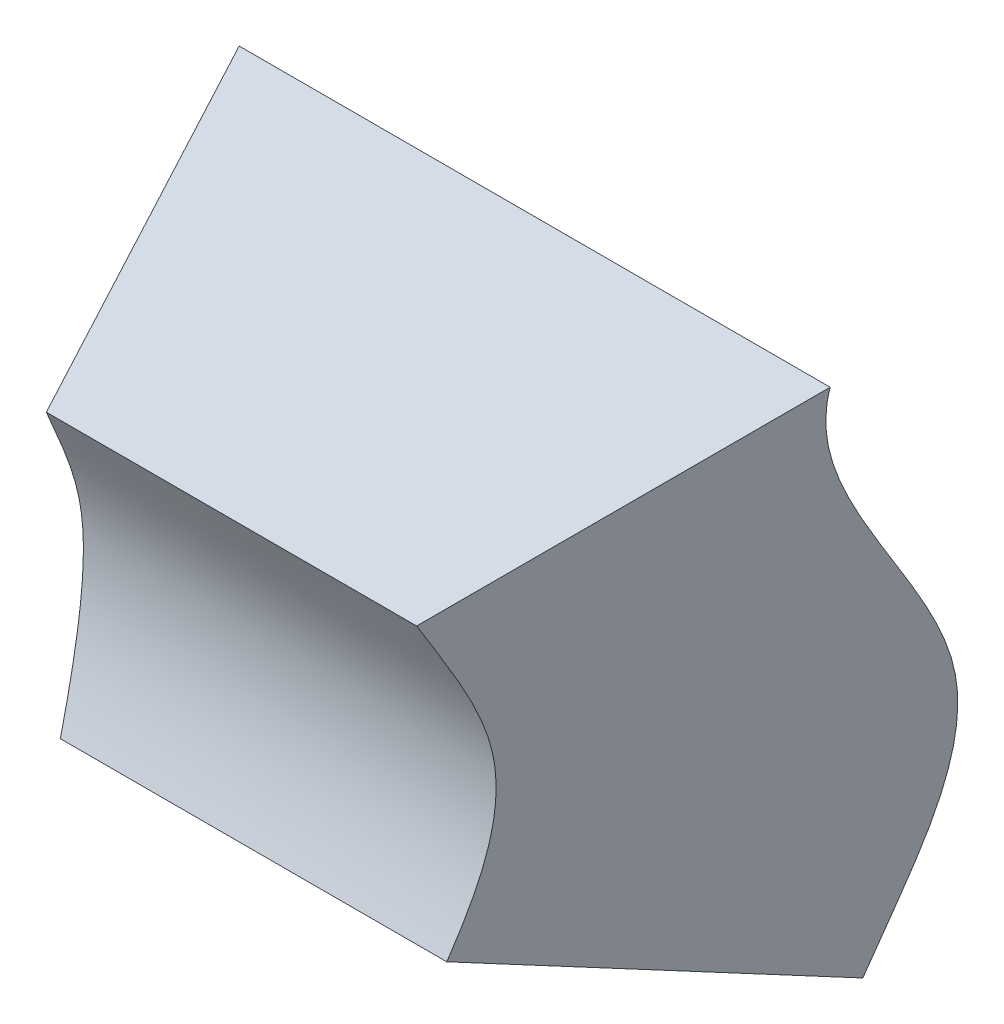
ISO-10303-21;
HEADER;
FILE_DESCRIPTION(('STEP AP214'),'2;1');
FILE_NAME('part.step','',(''),(''),'','','');
FILE_SCHEMA(('AUTOMOTIVE_DESIGN { 1 0 10303 214 1 1 1 1 }'));
ENDSEC;
DATA;
#1=APPLICATION_CONTEXT('core data for automotive mechanical design processes');
#2=APPLICATION_PROTOCOL_DEFINITION('international standard','automotive_design',2000,#1);
#3=PRODUCT_CONTEXT('',#1,'mechanical');
#4=PRODUCT('Part','Part','',(#3));
#5=PRODUCT_RELATED_PRODUCT_CATEGORY('part','',(#4));
#6=PRODUCT_DEFINITION_FORMATION('','',#4);
#7=PRODUCT_DEFINITION_CONTEXT('part definition',#1,'design');
#8=PRODUCT_DEFINITION('design','',#6,#7);
#9=PRODUCT_DEFINITION_SHAPE('','',#8);
#10=(LENGTH_UNIT() NAMED_UNIT(*) SI_UNIT(.MILLI.,.METRE.));
#11=(NAMED_UNIT(*) PLANE_ANGLE_UNIT() SI_UNIT($,.RADIAN.));
#12=(NAMED_UNIT(*) SI_UNIT($,.STERADIAN.) SOLID_ANGLE_UNIT());
#13=UNCERTAINTY_MEASURE_WITH_UNIT(LENGTH_MEASURE(1.E-05),#10,'distance_accuracy_value','');
#14=(GEOMETRIC_REPRESENTATION_CONTEXT(3) GLOBAL_UNCERTAINTY_ASSIGNED_CONTEXT((#13)) GLOBAL_UNIT_ASSIGNED_CONTEXT((#10,
#11,#12)) REPRESENTATION_CONTEXT('',''));
#15=CARTESIAN_POINT('',(0.,0.,0.));
#16=DIRECTION('',(0.,0.,1.));
#17=DIRECTION('',(1.,0.,0.));
#18=AXIS2_PLACEMENT_3D('',#15,#16,#17);
#19=CARTESIAN_POINT('',(0.,0.,0.));
#20=DIRECTION('',(-0.939692620785908,0.,0.342020143325669));
#21=DIRECTION('',(0.342020143325669,0.,0.939692620785908));
#22=AXIS2_PLACEMENT_3D('',#19,#20,#21);
#23=PLANE('',#22);
#24=CARTESIAN_POINT('',(2.9876665244987,-2.9876665244987,8.20854631292063));
#25=CARTESIAN_POINT('',(2.9972551182165,-3.10072374419156,8.2348907576446));
#26=CARTESIAN_POINT('',(3.00591501438279,-3.21445332463872,8.2586836268163));
#27=CARTESIAN_POINT('',(3.02135991706898,-3.4429882873727,8.30111814819229));
#28=CARTESIAN_POINT('',(3.02814504045837,-3.55779360213894,8.31976012149285));
#29=CARTESIAN_POINT('',(3.03981520523351,-3.78804972163956,8.35182363569388));
#30=CARTESIAN_POINT('',(3.04470312605109,-3.90349927628609,8.36525308776825));
#31=CARTESIAN_POINT('',(3.05260455180938,-4.13493618541207,8.38696207662065));
#32=CARTESIAN_POINT('',(3.05561804943225,-4.25092354198936,8.39524159329305));
#33=CARTESIAN_POINT('',(3.06180950570983,-4.59515875538895,8.41225247960925));
#34=CARTESIAN_POINT('',(3.06234637991077,-4.82385505361472,8.41372752935344));
#35=CARTESIAN_POINT('',(3.05671077914176,-5.28052847385759,8.3982438434955));
#36=CARTESIAN_POINT('',(3.05053588308327,-5.5085053065874,8.38127845600733));
#37=CARTESIAN_POINT('',(3.02866760758411,-6.04687586202529,8.32119586287096));
#38=CARTESIAN_POINT('',(3.01028556730297,-6.35633966601876,8.27069162227503));
#39=CARTESIAN_POINT('',(2.96396362665807,-6.9690679357488,8.14342313632786));
#40=CARTESIAN_POINT('',(2.93601796933866,-7.27232855058833,8.06664307387097));
#41=CARTESIAN_POINT('',(2.87222734797819,-7.87419434501463,7.89137978211009));
#42=CARTESIAN_POINT('',(2.83632119557993,-8.17274314973624,7.79272843917638));
#43=CARTESIAN_POINT('',(2.75849081821395,-8.7628174569167,7.5788912348157));
#44=CARTESIAN_POINT('',(2.71656905482476,-9.05434577544068,7.46371213652018));
#45=CARTESIAN_POINT('',(2.63678293415388,-9.57507994680996,7.24450157159106));
#46=CARTESIAN_POINT('',(2.59972185619697,-9.80535165069111,7.14267709676381));
#47=CARTESIAN_POINT('',(2.52328357452186,-10.2625973495167,6.93266464387954));
#48=CARTESIAN_POINT('',(2.48390615459335,-10.4895710341463,6.82447607178957));
#49=CARTESIAN_POINT('',(2.40337093254823,-10.9410466552401,6.60320736774985));
#50=CARTESIAN_POINT('',(2.36221155255672,-11.1655461707638,6.49012290062442));
#51=CARTESIAN_POINT('',(2.27864570556818,-11.6125581980294,6.26052762298581));
#52=CARTESIAN_POINT('',(2.23623918007341,-11.8350706159256,6.14401665175139));
#53=CARTESIAN_POINT('',(2.1077458381293,-12.5011640713613,5.79098409620969));
#54=CARTESIAN_POINT('',(2.02048032059958,-12.9427837565999,5.55122405729978));
#55=CARTESIAN_POINT('',(1.84631508206139,-13.8256801063325,5.07270899716217));
#56=CARTESIAN_POINT('',(1.75941499537339,-14.2669561388336,4.83395297123825));
#57=CARTESIAN_POINT('',(1.63182230021199,-14.9330947459998,4.48339492239493));
#58=CARTESIAN_POINT('',(1.58977386371592,-15.155718569538,4.3678677925986));
#59=CARTESIAN_POINT('',(1.50705367905619,-15.6031355269338,4.14059595311289));
#60=CARTESIAN_POINT('',(1.46638185343009,-15.8279285378125,4.02885103059719));
#61=CARTESIAN_POINT('',(1.38694396324922,-16.280299838458,3.81059722107611));
#62=CARTESIAN_POINT('',(1.34817730102155,-16.5078772263868,3.70408669197797));
#63=CARTESIAN_POINT('',(1.27313142200774,-16.9664982385328,3.49789983396441));
#64=CARTESIAN_POINT('',(1.23685183751461,-17.197541344171,3.39822249478234));
#65=CARTESIAN_POINT('',(1.17590221334383,-17.6069550876531,3.23076477864887));
#66=CARTESIAN_POINT('',(1.15055534072074,-17.7844623560215,3.16112481846314));
#67=CARTESIAN_POINT('',(1.10200673914472,-18.142009582896,3.02773863188692));
#68=CARTESIAN_POINT('',(1.0788053061433,-18.3220498868854,2.96399321861653));
#69=CARTESIAN_POINT('',(1.03493528652325,-18.6846723682696,2.84346133031943));
#70=CARTESIAN_POINT('',(1.01426555014238,-18.8672533495548,2.78667169634689));
#71=CARTESIAN_POINT('',(0.975858419927004,-19.2349812477879,2.6811489733341));
#72=CARTESIAN_POINT('',(0.958119990158336,-19.4201272330752,2.63241303808811));
#73=CARTESIAN_POINT('',(0.926134965858192,-19.791575540318,2.54453490606275));
#74=CARTESIAN_POINT('',(0.911863967062016,-19.9778597223472,2.5053256591172));
#75=CARTESIAN_POINT('',(0.88703598731128,-20.3526079267306,2.43711134538137));
#76=CARTESIAN_POINT('',(0.876480354920777,-20.5410727149942,2.4081099837404));
#77=CARTESIAN_POINT('',(0.859003373300636,-20.9194677441431,2.36009237137884));
#78=CARTESIAN_POINT('',(0.852082763682711,-21.1093982752898,2.34107815272473));
#79=CARTESIAN_POINT('',(0.841776206072706,-21.4900314372436,2.31276111841893));
#80=CARTESIAN_POINT('',(0.838389629493185,-21.6807339246855,2.30345657573745));
#81=CARTESIAN_POINT('',(0.834441767041166,-22.123945506082,2.29260991279541));
#82=CARTESIAN_POINT('',(0.83514373425192,-22.3765545472388,2.29453855185616));
#83=CARTESIAN_POINT('',(0.841992367854425,-22.8811376942549,2.31335501803316));
#84=CARTESIAN_POINT('',(0.848139866701164,-23.1331116971299,2.3302451323007));
#85=CARTESIAN_POINT('',(0.865359261704185,-23.63561514478,2.37755503124817));
#86=CARTESIAN_POINT('',(0.876431618087728,-23.8861444523316,2.4079760803921));
#87=CARTESIAN_POINT('',(0.90319702983536,-24.3896302155137,2.48151344479113));
#88=CARTESIAN_POINT('',(0.918968888912201,-24.6425503991794,2.52484627146757));
#89=CARTESIAN_POINT('',(0.954491738095091,-25.1459060199011,2.62244449747225));
#90=CARTESIAN_POINT('',(0.974241807112793,-25.3963420180715,2.67670736613106));
#91=CARTESIAN_POINT('',(1.01719121715819,-25.8945761719755,2.79470990040967));
#92=CARTESIAN_POINT('',(1.04038959960546,-26.1423750403433,2.85844693235143));
#93=CARTESIAN_POINT('',(1.09899522823657,-26.727711398352,3.01946457366835));
#94=CARTESIAN_POINT('',(1.13572191703173,-27.0641170345118,3.12037032182438));
#95=CARTESIAN_POINT('',(1.21366616556173,-27.7324724688052,3.33452038463693));
#96=CARTESIAN_POINT('',(1.25488463596444,-28.0644213479922,3.44776720133284));
#97=CARTESIAN_POINT('',(1.34088748755272,-28.7247237727867,3.68405809408033));
#98=CARTESIAN_POINT('',(1.38567561050195,-29.0530731242125,3.80711245054311));
#99=CARTESIAN_POINT('',(1.47799393715686,-29.7068954592558,4.06075496842929));
#100=CARTESIAN_POINT('',(1.52552734128805,-30.0323645539462,4.19135192294955));
#101=CARTESIAN_POINT('',(1.62258883475532,-30.681059396535,4.45802618454942));
#102=CARTESIAN_POINT('',(1.67211855239364,-31.0042830503045,4.59410796535265));
#103=CARTESIAN_POINT('',(1.7692662647474,-31.6284007109605,4.8610191113963));
#104=CARTESIAN_POINT('',(1.81680418365874,-31.9294018151631,4.99162847017307));
#105=CARTESIAN_POINT('',(1.91248474122992,-32.5303527787303,5.2545086415807));
#106=CARTESIAN_POINT('',(1.9606269897462,-32.830303171032,5.38677838230096));
#107=CARTESIAN_POINT('',(2.0569978044755,-33.4295295689778,5.65155501966415));
#108=CARTESIAN_POINT('',(2.10522612964553,-33.7288059080916,5.78406125404693));
#109=CARTESIAN_POINT('',(2.20126550547599,-34.3270436214445,6.04792727051964));
#110=CARTESIAN_POINT('',(2.24907728672307,-34.6260039851368,6.1792890598799));
#111=CARTESIAN_POINT('',(2.34378364545697,-35.2239542804302,6.43949264198005));
#112=CARTESIAN_POINT('',(2.39068074572801,-35.5229408028951,6.56834136601262));
#113=CARTESIAN_POINT('',(2.43697260935573,-35.822740495434,6.69552721603427));
#114=B_SPLINE_CURVE_WITH_KNOTS('',3,(#24,#25,#26,#27,#28,#29,#30,#31,#32,#33,#34,#35,#36,#37,
#38,#39,#40,#41,#42,#43,#44,#45,#46,#47,#48,#49,#50,#51,#52,#53,#54,#55,#56,#57,#58,#59,#60,#61,
#62,#63,#64,#65,#66,#67,#68,#69,#70,#71,#72,#73,#74,#75,#76,#77,#78,#79,#80,#81,#82,#83,#84,#85,
#86,#87,#88,#89,#90,#91,#92,#93,#94,#95,#96,#97,#98,#99,#100,#101,#102,#103,#104,#105,#106,#107,
#108,#109,#110,#111,#112,#113),.UNSPECIFIED.,.F.,.F.,(4,2,2,2,2,2,2,2,2,2,2,2,2,2,2,2,2,2,2,2,2,
2,2,2,2,2,2,2,2,2,2,2,2,2,2,2,2,2,2,2,2,2,2,2,4),(0.,0.349408822123913,0.698795857903406,
1.04765052714846,1.39650655833239,2.08160997002687,2.76696059617885,3.70758080950924,
4.6487682414783,5.59745769690426,6.54576005128864,7.3091127095846,8.0725367336027,
8.83665115614336,9.60080147705313,11.1308640041962,12.6584078863827,13.4213216204485,
14.1841923534422,14.946822216605,15.7093390829659,16.2863099534718,16.8633602955516,
17.4401475925706,18.016730612954,18.5891296923225,19.1617363212696,19.7344594123958,
20.307080617679,21.0643574961891,21.8217501591202,22.5792136151671,23.3501712900211,
24.1209506672066,24.891516178385,25.950538767794,27.0097764652591,28.0701394551604,
29.1317645883861,30.1942738959334,31.1888901428149,32.182894309456,33.1753935258469,
34.1654733940416,35.1522584855172),.UNSPECIFIED.);
#115=CARTESIAN_POINT('',(2.9876665244987,-2.9876665244987,8.20854631292063));
#116=VERTEX_POINT('',#115);
#117=CARTESIAN_POINT('',(2.43697260935574,-35.822740495434,6.69552721603427));
#118=VERTEX_POINT('',#117);
#119=EDGE_CURVE('E244',#116,#118,#114,.T.);
#120=ORIENTED_EDGE('',*,*,#119,.T.);
#121=DIRECTION('',(-0.323615577118185,-0.323615577118185,-0.889126490715988));
#122=VECTOR('',#121,1.);
#123=CARTESIAN_POINT('',(0.,-38.2597131047897,0.));
#124=LINE('',#123,#122);
#125=CARTESIAN_POINT('',(9.45729808338407,-28.8024150214057,25.9837129331492));
#126=VERTEX_POINT('',#125);
#127=EDGE_CURVE('E123',#126,#118,#124,.T.);
#128=ORIENTED_EDGE('',*,*,#127,.F.);
#129=CARTESIAN_POINT('',(9.96566052894238,-9.96566052894238,27.3804272732193));
#130=CARTESIAN_POINT('',(9.92685018901015,-10.1662302755172,27.2737967406142));
#131=CARTESIAN_POINT('',(9.88774327394846,-10.3663030676911,27.1663513745377));
#132=CARTESIAN_POINT('',(9.80909820646466,-10.7667209052558,26.9502758274744));
#133=CARTESIAN_POINT('',(9.76955898737714,-10.9670641628169,26.8416427158486));
#134=CARTESIAN_POINT('',(9.69040198883556,-11.3683246393751,26.6241606497638));
#135=CARTESIAN_POINT('',(9.65078427855441,-11.5692419735998,26.5153118853558));
#136=CARTESIAN_POINT('',(9.57182703672667,-11.9719632659182,26.2983786463317));
#137=CARTESIAN_POINT('',(9.53248803722567,-12.1737681192705,26.1902956334988));
#138=CARTESIAN_POINT('',(9.45445605379572,-12.5785946740958,25.9759045210297));
#139=CARTESIAN_POINT('',(9.41576344171993,-12.781616990481,25.8695974430518));
#140=CARTESIAN_POINT('',(9.33812473726114,-13.1960777373947,25.6562868556755));
#141=CARTESIAN_POINT('',(9.29921302943347,-13.4075714716265,25.5493778170666));
#142=CARTESIAN_POINT('',(9.22292898799617,-13.8326961258691,25.3397891357529));
#143=CARTESIAN_POINT('',(9.18555534994728,-14.0463250355761,25.2371059091307));
#144=CARTESIAN_POINT('',(9.11282281153924,-14.4762137153775,25.037274902195));
#145=CARTESIAN_POINT('',(9.07746170626768,-14.6924702785184,24.9401210639344));
#146=CARTESIAN_POINT('',(9.00927247340223,-15.128165263332,24.7527726863867));
#147=CARTESIAN_POINT('',(8.97644220158084,-15.3476008001322,24.6625722558828));
#148=CARTESIAN_POINT('',(8.91388613578072,-15.7902948221348,24.4907008776471));
#149=CARTESIAN_POINT('',(8.88416077765239,-16.0135538389496,24.4090311274043));
#150=CARTESIAN_POINT('',(8.83584868866706,-16.4047854589981,24.2762947538304));
#151=CARTESIAN_POINT('',(8.81638999902506,-16.5718360850759,24.2228324434269));
#152=CARTESIAN_POINT('',(8.77984978469958,-16.9081911937868,24.1224390296656));
#153=CARTESIAN_POINT('',(8.76276869805376,-17.0774960854559,24.0755091298064));
#154=CARTESIAN_POINT('',(8.73132415419315,-17.4181971858704,23.9891159555844));
#155=CARTESIAN_POINT('',(8.71695954235333,-17.5895924729778,23.9496495089152));
#156=CARTESIAN_POINT('',(8.69771741377841,-17.8481137360389,23.8967821951534));
#157=CARTESIAN_POINT('',(8.69168811140681,-17.9345146694784,23.8802168230323));
#158=CARTESIAN_POINT('',(8.68042087515035,-18.107756461371,23.8492603458381));
#159=CARTESIAN_POINT('',(8.67518294460728,-18.1945973216802,23.8348692499463));
#160=CARTESIAN_POINT('',(8.66077868213956,-18.4532612959753,23.7952938640724));
#161=CARTESIAN_POINT('',(8.65274322254546,-18.62563372449,23.7732166202826));
#162=CARTESIAN_POINT('',(8.63965760388117,-18.9714318790573,23.7372641784829));
#163=CARTESIAN_POINT('',(8.63460917964813,-19.1448581582246,23.7233937468988));
#164=CARTESIAN_POINT('',(8.62740258539165,-19.4922962066346,23.7035937919079));
#165=CARTESIAN_POINT('',(8.62524565716517,-19.6663081952782,23.6976676803103));
#166=CARTESIAN_POINT('',(8.62369693341634,-20.0144209787687,23.6934125967814));
#167=CARTESIAN_POINT('',(8.62430509728726,-20.1885217722739,23.6950835132841));
#168=CARTESIAN_POINT('',(8.62945182320703,-20.6558596655785,23.7092240265328));
#169=CARTESIAN_POINT('',(8.63640059305044,-20.9488871734121,23.7283156147705));
#170=CARTESIAN_POINT('',(8.65692250275788,-21.532909633559,23.7846990982958));
#171=CARTESIAN_POINT('',(8.67049650167406,-21.8239043173242,23.8219933538097));
#172=CARTESIAN_POINT('',(8.70341995119887,-22.4030839140823,23.9124497879497));
#173=CARTESIAN_POINT('',(8.72277008861089,-22.6912684887329,23.9656138535526));
#174=CARTESIAN_POINT('',(8.7667313998706,-23.268417074743,24.0863965635682));
#175=CARTESIAN_POINT('',(8.79141295931987,-23.5573347011386,24.154208590832));
#176=CARTESIAN_POINT('',(8.84507201483249,-24.1316457010319,24.3016356342022));
#177=CARTESIAN_POINT('',(8.87404867447462,-24.4170397490097,24.3812483522602));
#178=CARTESIAN_POINT('',(8.93558847726278,-24.9844694736127,24.5503275708183));
#179=CARTESIAN_POINT('',(8.9681514915966,-25.2665052704543,24.6397937174099));
#180=CARTESIAN_POINT('',(9.02477280059314,-25.733053097682,24.7953594853378));
#181=CARTESIAN_POINT('',(9.048003657157,-25.9184319233605,24.8591857391816));
#182=CARTESIAN_POINT('',(9.09559808340548,-26.2879122187071,24.9899503505912));
#183=CARTESIAN_POINT('',(9.1199614940057,-26.4720138636246,25.0568882710762));
#184=CARTESIAN_POINT('',(9.16966991517095,-26.8390775957238,25.1934610357845));
#185=CARTESIAN_POINT('',(9.19501492578697,-27.0220396828463,25.2630958801479));
#186=CARTESIAN_POINT('',(9.24603367544966,-27.383329066899,25.4032687428149));
#187=CARTESIAN_POINT('',(9.27169092109309,-27.561676309367,25.4737614458656));
#188=CARTESIAN_POINT('',(9.3236870899834,-27.9175144159599,25.6166197457899));
#189=CARTESIAN_POINT('',(9.35002600394254,-28.0950052917138,25.6889853171456));
#190=CARTESIAN_POINT('',(9.40326737128786,-28.4492360186888,25.8352647717078));
#191=CARTESIAN_POINT('',(9.43016975073662,-28.6259759648303,25.9091784517728));
#192=CARTESIAN_POINT('',(9.4572980833841,-28.8024150214057,25.9837129331492));
#193=B_SPLINE_CURVE_WITH_KNOTS('',3,(#129,#130,#131,#132,#133,#134,#135,#136,#137,#138,#139,
#140,#141,#142,#143,#144,#145,#146,#147,#148,#149,#150,#151,#152,#153,#154,#155,#156,#157,#158,
#159,#160,#161,#162,#163,#164,#165,#166,#167,#168,#169,#170,#171,#172,#173,#174,#175,#176,#177,
#178,#179,#180,#181,#182,#183,#184,#185,#186,#187,#188,#189,#190,#191,#192),.UNSPECIFIED.,.F.,
.F.,(4,2,2,2,2,2,2,2,2,2,2,2,2,2,2,2,2,2,2,2,2,2,2,2,2,2,2,2,2,2,2,4),(0.,0.691323283928701,
1.38523635816184,2.08098667846788,2.77782526529945,3.47505180697966,4.19547185161754,
4.91526775640306,5.63425924622486,6.35263472419253,7.07111090854643,7.60040035672205,
8.1297871898328,8.658948501271,8.92346311569814,9.18797884707696,9.70962778523814,
10.231579394704,10.753755092497,11.2759231219084,12.1563244150852,13.0368398947487,
13.9174601125627,14.8105067850571,15.7033797749435,16.5962207056872,17.1884813729679,
17.780659098151,18.3728368540921,18.9532680285219,19.5336912987269,20.1140388776575),.UNSPECIFIED.);
#194=CARTESIAN_POINT('',(9.96566052894238,-9.96566052894238,27.3804272732193));
#195=VERTEX_POINT('',#194);
#196=EDGE_CURVE('E240',#195,#126,#193,.T.);
#197=ORIENTED_EDGE('',*,*,#196,.F.);
#198=DIRECTION('',(-0.323615577118185,0.323615577118185,-0.889126490715988));
#199=VECTOR('',#198,1.);
#200=CARTESIAN_POINT('',(0.,0.,0.));
#201=LINE('',#200,#199);
#202=EDGE_CURVE('E235',#195,#116,#201,.T.);
#203=ORIENTED_EDGE('',*,*,#202,.T.);
#204=EDGE_LOOP('',(#120,#128,#197,#203));
#205=FACE_BOUND('',#204,.T.);
#206=ADVANCED_FACE('F186',(#205),#23,.T.);
#207=CARTESIAN_POINT('',(0.,-38.2597131047897,0.));
#208=DIRECTION('',(0.,-0.939692620785908,0.342020143325669));
#209=DIRECTION('',(0.,-0.342020143325669,-0.939692620785908));
#210=AXIS2_PLACEMENT_3D('',#207,#208,#209);
#211=PLANE('',#210);
#212=DIRECTION('',(1.,0.,0.));
#213=VECTOR('',#212,1.);
#214=CARTESIAN_POINT('',(21.6753616581571,-35.8227404954339,6.69552721603426));
#215=LINE('',#214,#213);
#216=CARTESIAN_POINT('',(40.9137507069584,-35.822740495434,6.69552721603427));
#217=VERTEX_POINT('',#216);
#218=EDGE_CURVE('E246',#118,#217,#215,.T.);
#219=ORIENTED_EDGE('',*,*,#218,.T.);
#220=DIRECTION('',(0.323615577118185,-0.323615577118185,-0.889126490715988));
#221=VECTOR('',#220,1.);
#222=CARTESIAN_POINT('',(39.3438967445105,-34.2528865329861,11.0086655297012));
#223=LINE('',#222,#221);
#224=CARTESIAN_POINT('',(33.89342523293,-28.8024150214057,25.9837129331492));
#225=VERTEX_POINT('',#224);
#226=EDGE_CURVE('E198',#225,#217,#223,.T.);
#227=ORIENTED_EDGE('',*,*,#226,.F.);
#228=DIRECTION('',(1.,0.,0.));
#229=VECTOR('',#228,1.);
#230=CARTESIAN_POINT('',(21.6753616581571,-28.8024150214056,25.9837129331492));
#231=LINE('',#230,#229);
#232=EDGE_CURVE('E254',#126,#225,#231,.T.);
#233=ORIENTED_EDGE('',*,*,#232,.F.);
#234=ORIENTED_EDGE('',*,*,#127,.T.);
#235=EDGE_LOOP('',(#219,#227,#233,#234));
#236=FACE_BOUND('',#235,.T.);
#237=ADVANCED_FACE('F262',(#236),#211,.T.);
#238=CARTESIAN_POINT('',(43.3507233163141,0.,0.));
#239=DIRECTION('',(0.939692620785908,0.,0.342020143325669));
#240=DIRECTION('',(0.342020143325669,0.,-0.939692620785908));
#241=AXIS2_PLACEMENT_3D('',#238,#239,#240);
#242=PLANE('',#241);
#243=CARTESIAN_POINT('',(40.9137507069584,-35.822740495434,6.69552721603427));
#244=CARTESIAN_POINT('',(40.9637624344808,-35.4988524156093,6.55812112395854));
#245=CARTESIAN_POINT('',(41.0144798611963,-35.1759146492827,6.41877613928472));
#246=CARTESIAN_POINT('',(41.1175571221776,-34.5260977454529,6.13557369227962));
#247=CARTESIAN_POINT('',(41.1699302428618,-34.1992365838791,5.9916797258132));
#248=CARTESIAN_POINT('',(41.2755740690052,-33.5419280183179,5.70142569897935));
#249=CARTESIAN_POINT('',(41.328847969481,-33.2114850509332,5.55505686037586));
#250=CARTESIAN_POINT('',(41.4354988627867,-32.5472880603214,5.26203593925388));
#251=CARTESIAN_POINT('',(41.4888728442513,-32.2135298789955,5.11539213039362));
#252=CARTESIAN_POINT('',(41.5948755472035,-31.5429067449013,4.82415209763118));
#253=CARTESIAN_POINT('',(41.6474990079879,-31.2060346461604,4.6795703273925));
#254=CARTESIAN_POINT('',(41.7510996330159,-30.529315466425,4.39492994948667));
#255=CARTESIAN_POINT('',(41.80207330981,-30.1894637966879,4.25488092350841));
#256=CARTESIAN_POINT('',(41.9045848517295,-29.485094324419,3.97323277685094));
#257=CARTESIAN_POINT('',(41.9559568583758,-29.1203686044235,3.8320893485983));
#258=CARTESIAN_POINT('',(42.054556988361,-28.3874155878562,3.56118771790847));
#259=CARTESIAN_POINT('',(42.1017973805894,-28.0192025256592,3.43139580697483));
#260=CARTESIAN_POINT('',(42.1908231351921,-27.2790856614395,3.18679955645403));
#261=CARTESIAN_POINT('',(42.2326332912146,-26.907207623784,3.07192709687837));
#262=CARTESIAN_POINT('',(42.3093784105178,-26.1594666361612,2.86107161453955));
#263=CARTESIAN_POINT('',(42.3443481588678,-25.7836346643022,2.7649930205839));
#264=CARTESIAN_POINT('',(42.4058648452868,-25.0276164710243,2.59597731372802));
#265=CARTESIAN_POINT('',(42.4324447366974,-24.647453518861,2.52294966226572));
#266=CARTESIAN_POINT('',(42.4754814422696,-23.8821340146847,2.40470728549856));
#267=CARTESIAN_POINT('',(42.4919407516915,-23.4969787174812,2.35948570452209));
#268=CARTESIAN_POINT('',(42.5068097266927,-22.9456420090822,2.31863353145568));
#269=CARTESIAN_POINT('',(42.5101574261479,-22.7805394796925,2.30943580279547));
#270=CARTESIAN_POINT('',(42.514518118902,-22.4498742672547,2.29745489792043));
#271=CARTESIAN_POINT('',(42.5155285269647,-22.2843112772784,2.29467882458378));
#272=CARTESIAN_POINT('',(42.5150730765363,-21.9531617956516,2.29593016435137));
#273=CARTESIAN_POINT('',(42.5136064754814,-21.787575311839,2.29995961763315));
#274=CARTESIAN_POINT('',(42.5080809726069,-21.4568018766635,2.3151408120118));
#275=CARTESIAN_POINT('',(42.5040226240851,-21.2916148475769,2.32629103293572));
#276=CARTESIAN_POINT('',(42.4933141704184,-20.9648677322429,2.35571226758235));
#277=CARTESIAN_POINT('',(42.4867105426366,-20.8032946677831,2.37385558579921));
#278=CARTESIAN_POINT('',(42.4708550025702,-20.4812691263275,2.41741832410491));
#279=CARTESIAN_POINT('',(42.4616032667695,-20.3208165753844,2.44283725930813));
#280=CARTESIAN_POINT('',(42.4404000057084,-20.0014532498443,2.50109274029249));
#281=CARTESIAN_POINT('',(42.4284486046683,-19.8425424046592,2.53392894478104));
#282=CARTESIAN_POINT('',(42.4020870088245,-19.52652822671,2.60635683410251));
#283=CARTESIAN_POINT('',(42.3876773509887,-19.3694245071904,2.64594704362848));
#284=CARTESIAN_POINT('',(42.3453795479707,-18.9432820556277,2.76215930231285));
#285=CARTESIAN_POINT('',(42.315319888974,-18.6760783719995,2.84474753664284));
#286=CARTESIAN_POINT('',(42.2499325912121,-18.1470458505522,3.0243976607629));
#287=CARTESIAN_POINT('',(42.2145998373188,-17.8852225156204,3.12147360425175));
#288=CARTESIAN_POINT('',(42.1397555291022,-17.3663585400918,3.32710665105179));
#289=CARTESIAN_POINT('',(42.1002383907938,-17.1093248427146,3.43567909623537));
#290=CARTESIAN_POINT('',(42.0180142574258,-16.5996275251678,3.66158804599821));
#291=CARTESIAN_POINT('',(41.9753065752752,-16.3469648608219,3.77892643834424));
#292=CARTESIAN_POINT('',(41.8867008621422,-15.840482567316,4.02236863441175));
#293=CARTESIAN_POINT('',(41.8407579407691,-15.586730522205,4.1485957734683));
#294=CARTESIAN_POINT('',(41.747216942283,-15.0822261491178,4.40559755460197));
#295=CARTESIAN_POINT('',(41.6996207388132,-14.8314708321346,4.5363670488872));
#296=CARTESIAN_POINT('',(41.6034108813472,-14.3318007257964,4.80070145980382));
#297=CARTESIAN_POINT('',(41.5547977211203,-14.0828851191577,4.93426501981569));
#298=CARTESIAN_POINT('',(41.4571495654722,-13.5858076601169,5.20255112251027));
#299=CARTESIAN_POINT('',(41.4081146233889,-13.3376457176256,5.33727351864837));
#300=CARTESIAN_POINT('',(41.2983093510375,-12.7807064046532,5.63896102497089));
#301=CARTESIAN_POINT('',(41.2375830016648,-12.471854270672,5.80580529863832));
#302=CARTESIAN_POINT('',(41.1175113699326,-11.8517137315884,6.13569939553956));
#303=CARTESIAN_POINT('',(41.0581665326751,-11.5404245833285,6.29874799586585));
#304=CARTESIAN_POINT('',(40.9420771515394,-10.9133098732267,6.61770094917454));
#305=CARTESIAN_POINT('',(40.8853351116335,-10.5974803116372,6.77359842254967));
#306=CARTESIAN_POINT('',(40.7765211672485,-9.96296387927048,7.07256227766931));
#307=CARTESIAN_POINT('',(40.7244075961436,-9.64433883918576,7.21574313752723));
#308=CARTESIAN_POINT('',(40.6259467225216,-8.99977186539001,7.48626216450331));
#309=CARTESIAN_POINT('',(40.5795950276651,-8.6738357315497,7.61361239947505));
#310=CARTESIAN_POINT('',(40.4947297227204,-8.01363366883073,7.84677790850578));
#311=CARTESIAN_POINT('',(40.4562053450365,-7.67937990284876,7.95262276629093));
#312=CARTESIAN_POINT('',(40.4078350903727,-7.18902975992311,8.08551894875281));
#313=CARTESIAN_POINT('',(40.3938915579221,-7.03636101539995,8.12382848930845));
#314=CARTESIAN_POINT('',(40.3683067898782,-6.72934746459678,8.19412206179091));
#315=CARTESIAN_POINT('',(40.3566658339148,-6.57500245714588,8.22610532544116));
#316=CARTESIAN_POINT('',(40.3359349679184,-6.26481912466966,8.283062911652));
#317=CARTESIAN_POINT('',(40.3268454789982,-6.10898055752051,8.30803607721472));
#318=CARTESIAN_POINT('',(40.3114823618099,-5.79648169045232,8.35024589478208));
#319=CARTESIAN_POINT('',(40.3052021952317,-5.6398241661197,8.36750051064623));
#320=CARTESIAN_POINT('',(40.2956536207008,-5.32573406387813,8.39373500355768));
#321=CARTESIAN_POINT('',(40.2923848823936,-5.16830157288863,8.40271578824696));
#322=CARTESIAN_POINT('',(40.2890547169697,-4.85320893222404,8.41186534255213));
#323=CARTESIAN_POINT('',(40.2889917411964,-4.69554892926948,8.41203836706715));
#324=CARTESIAN_POINT('',(40.2919385339642,-4.40772966287058,8.40394212047771));
#325=CARTESIAN_POINT('',(40.2944195732538,-4.27752278744004,8.39712552105278));
#326=CARTESIAN_POINT('',(40.3017269735181,-4.01769247932318,8.37704860383181));
#327=CARTESIAN_POINT('',(40.3065528930028,-3.8880689414419,8.3637894990195));
#328=CARTESIAN_POINT('',(40.3186001946709,-3.62919113227635,8.33068980972095));
#329=CARTESIAN_POINT('',(40.3258321018188,-3.49994104570779,8.31082030813268));
#330=CARTESIAN_POINT('',(40.3426690076882,-3.24273183026097,8.26456128944279));
#331=CARTESIAN_POINT('',(40.3522746671335,-3.11477307115716,8.23816995701787));
#332=CARTESIAN_POINT('',(40.3630567918154,-2.98766652449869,8.20854631292062));
#333=B_SPLINE_CURVE_WITH_KNOTS('',3,(#243,#244,#245,#246,#247,#248,#249,#250,#251,#252,#253,
#254,#255,#256,#257,#258,#259,#260,#261,#262,#263,#264,#265,#266,#267,#268,#269,#270,#271,#272,
#273,#274,#275,#276,#277,#278,#279,#280,#281,#282,#283,#284,#285,#286,#287,#288,#289,#290,#291,
#292,#293,#294,#295,#296,#297,#298,#299,#300,#301,#302,#303,#304,#305,#306,#307,#308,#309,#310,
#311,#312,#313,#314,#315,#316,#317,#318,#319,#320,#321,#322,#323,#324,#325,#326,#327,#328,#329,
#330,#331,#332),.UNSPECIFIED.,.F.,.F.,(4,2,2,2,2,2,2,2,2,2,2,2,2,2,2,2,2,2,2,2,2,2,2,2,2,2,2,2,
2,2,2,2,2,2,2,2,2,2,2,2,2,2,2,2,4),(0.,1.06606787924905,2.14891670389178,3.24486158353145,
4.35017455279251,5.46118585967331,6.57440983030369,7.75759334448954,8.9371347974908,
10.1110856515855,11.2789019504575,12.4420725641696,13.6049562795005,14.1010203474247,
14.5976328411295,15.0943942369781,15.5910496174429,16.0790355574087,16.5669889829784,
17.0549199608017,17.5427444938696,18.3859610293237,19.2300009024742,20.0751816760141,
20.9205449887742,21.7818045658072,22.6421180418289,23.5020230784462,24.3618209263479,
25.4305649991975,26.4996487683499,27.5697403379117,28.6289368649324,29.68732093805,
30.7442390447131,31.2181703200025,31.6921591152287,32.1662260950982,32.6391839348767,
33.1120898848462,33.5847673787518,33.9758220555815,34.3668031338284,34.7595175499773,
35.152341399844),.UNSPECIFIED.);
#334=CARTESIAN_POINT('',(40.3630567918154,-2.9876665244987,8.20854631292063));
#335=VERTEX_POINT('',#334);
#336=EDGE_CURVE('E228',#217,#335,#333,.T.);
#337=ORIENTED_EDGE('',*,*,#336,.T.);
#338=DIRECTION('',(0.323615577118185,0.323615577118185,-0.889126490715988));
#339=VECTOR('',#338,1.);
#340=CARTESIAN_POINT('',(38.8107303055205,-4.53999301079362,12.4735282816372));
#341=LINE('',#340,#339);
#342=CARTESIAN_POINT('',(33.3850627873717,-9.96566052894238,27.3804272732193));
#343=VERTEX_POINT('',#342);
#344=EDGE_CURVE('E237',#343,#335,#341,.T.);
#345=ORIENTED_EDGE('',*,*,#344,.F.);
#346=CARTESIAN_POINT('',(33.89342523293,-28.8024150214057,25.9837129331492));
#347=CARTESIAN_POINT('',(33.9348034216966,-28.5332643744685,25.870027293855));
#348=CARTESIAN_POINT('',(33.9756641580797,-28.2634098659951,25.7577633433002));
#349=CARTESIAN_POINT('',(34.0561325676554,-27.7204479422976,25.5366782050116));
#350=CARTESIAN_POINT('',(34.0957326374227,-27.4473309134776,25.4278779075173));
#351=CARTESIAN_POINT('',(34.1731369772677,-26.8979753073125,25.2152112316252));
#352=CARTESIAN_POINT('',(34.2109356145659,-26.621729905238,25.1113603291623));
#353=CARTESIAN_POINT('',(34.2841495232915,-26.0662121391295,24.9102067681487));
#354=CARTESIAN_POINT('',(34.3195622977344,-25.7869369483794,24.8129109700064));
#355=CARTESIAN_POINT('',(34.3886634595706,-25.214819230563,24.6230570882034));
#356=CARTESIAN_POINT('',(34.4222384794053,-24.9218588265306,24.5308104793499));
#357=CARTESIAN_POINT('',(34.4854204511956,-24.3326914652588,24.3572194385396));
#358=CARTESIAN_POINT('',(34.5150325101713,-24.0364892290891,24.2758609751602));
#359=CARTESIAN_POINT('',(34.5694985774038,-23.4407834501915,24.1262166853123));
#360=CARTESIAN_POINT('',(34.5943592632617,-23.1412851756395,24.0579125122857));
#361=CARTESIAN_POINT('',(34.6384748903035,-22.5388653400285,23.9367058231433));
#362=CARTESIAN_POINT('',(34.6577324441527,-22.2359454430973,23.8837961287885));
#363=CARTESIAN_POINT('',(34.6861812964429,-21.6941004991828,23.8056335495119));
#364=CARTESIAN_POINT('',(34.6966549836834,-21.4557526174779,23.7768573303201));
#365=CARTESIAN_POINT('',(34.7131533832377,-20.9776658367605,23.7315283500876));
#366=CARTESIAN_POINT('',(34.7191771503159,-20.7379266531065,23.7149781860601));
#367=CARTESIAN_POINT('',(34.726321489758,-20.2577889295259,23.695349274766));
#368=CARTESIAN_POINT('',(34.7274418546049,-20.0173903621244,23.6922710976476));
#369=CARTESIAN_POINT('',(34.7244017782549,-19.5406251042318,23.7006236387727));
#370=CARTESIAN_POINT('',(34.7203236614291,-19.3042541633828,23.7118281726654));
#371=CARTESIAN_POINT('',(34.7067191944056,-18.8328388084466,23.7492061386164));
#372=CARTESIAN_POINT('',(34.6971933895806,-18.5977942639509,23.7753780722751));
#373=CARTESIAN_POINT('',(34.6786923385326,-18.2472346782931,23.8262092922655));
#374=CARTESIAN_POINT('',(34.6718252249002,-18.1307412617624,23.8450765319076));
#375=CARTESIAN_POINT('',(34.6566665354649,-17.8985443531037,23.8867246888395));
#376=CARTESIAN_POINT('',(34.6483749398256,-17.7828408719992,23.9095056606297));
#377=CARTESIAN_POINT('',(34.6277253955808,-17.5174247033589,23.9662398171642));
#378=CARTESIAN_POINT('',(34.6148964543999,-17.3680249180693,24.0014870433744));
#379=CARTESIAN_POINT('',(34.587187624996,-17.0708618825953,24.077616426481));
#380=CARTESIAN_POINT('',(34.5723075519098,-16.9230987812194,24.1184990912853));
#381=CARTESIAN_POINT('',(34.5248823174852,-16.4819794154556,24.2487988519794));
#382=CARTESIAN_POINT('',(34.4895803156848,-16.1911421513769,24.3457903047875));
#383=CARTESIAN_POINT('',(34.4132449468712,-15.6158855059182,24.5555200069084));
#384=CARTESIAN_POINT('',(34.3722078355835,-15.331470459457,24.6682685435312));
#385=CARTESIAN_POINT('',(34.2851203276311,-14.7640562352437,24.9075395051467));
#386=CARTESIAN_POINT('',(34.239002437846,-14.4811463704429,25.0342473659645));
#387=CARTESIAN_POINT('',(34.1435287135971,-13.9203889325597,25.2965592674894));
#388=CARTESIAN_POINT('',(34.0941757058774,-13.6425372041101,25.4321555417815));
#389=CARTESIAN_POINT('',(33.9932132903971,-13.090417991593,25.7095474985271));
#390=CARTESIAN_POINT('',(33.9416040830818,-12.8161501919229,25.8513426302618));
#391=CARTESIAN_POINT('',(33.8615060370796,-12.3978358521767,26.0714102029955));
#392=CARTESIAN_POINT('',(33.8335117241066,-12.252973263134,26.1483239457619));
#393=CARTESIAN_POINT('',(33.7772540676977,-11.9636900244212,26.3028905864169));
#394=CARTESIAN_POINT('',(33.748990717121,-11.8192693866164,26.3805435039244));
#395=CARTESIAN_POINT('',(33.6923139964877,-11.5306759068405,26.5362615140731));
#396=CARTESIAN_POINT('',(33.6639006227007,-11.3865030711504,26.6143266169635));
#397=CARTESIAN_POINT('',(33.6075298690207,-11.1006945466398,26.769203989817));
#398=CARTESIAN_POINT('',(33.5795730576214,-10.9590578978211,26.8460146978563));
#399=CARTESIAN_POINT('',(33.5237374457656,-10.6756575687762,26.9994217806315));
#400=CARTESIAN_POINT('',(33.4958586433451,-10.5338938918688,27.0760181607635));
#401=CARTESIAN_POINT('',(33.4402908356164,-10.2500570088314,27.2286894577466));
#402=CARTESIAN_POINT('',(33.4126018224639,-10.1079838158183,27.3047643961502));
#403=CARTESIAN_POINT('',(33.3850627873717,-9.96566052894238,27.3804272732193));
#404=B_SPLINE_CURVE_WITH_KNOTS('',3,(#346,#347,#348,#349,#350,#351,#352,#353,#354,#355,#356,
#357,#358,#359,#360,#361,#362,#363,#364,#365,#366,#367,#368,#369,#370,#371,#372,#373,#374,#375,
#376,#377,#378,#379,#380,#381,#382,#383,#384,#385,#386,#387,#388,#389,#390,#391,#392,#393,#394,
#395,#396,#397,#398,#399,#400,#401,#402,#403),.UNSPECIFIED.,.F.,.F.,(4,2,2,2,2,2,2,2,2,2,2,2,2,
2,2,2,2,2,2,2,2,2,2,2,2,2,2,2,4),(0.,0.885301078409076,1.77519655191271,2.66771307335085,
3.56114961823289,4.48786599922936,5.41337638958364,6.33757634136103,7.26134465791288,
7.98195450423324,8.70271737584729,9.42351075058826,10.1330300077927,10.8424782468361,
11.1970474199286,11.551621530936,12.0135831722831,12.4755864763266,13.4006662264237,
14.3263527785105,15.2663000607019,16.2054367207459,17.1444901149048,17.6436491894451,
18.1428215496752,18.6420063811157,19.1325997069454,19.6231805682301,20.1137410287626),.UNSPECIFIED.);
#405=EDGE_CURVE('E281',#225,#343,#404,.T.);
#406=ORIENTED_EDGE('',*,*,#405,.F.);
#407=ORIENTED_EDGE('',*,*,#226,.T.);
#408=EDGE_LOOP('',(#337,#345,#406,#407));
#409=FACE_BOUND('',#408,.T.);
#410=ADVANCED_FACE('F285',(#409),#242,.T.);
#411=CARTESIAN_POINT('',(0.,0.,0.));
#412=DIRECTION('',(0.,0.939692620785908,0.342020143325669));
#413=DIRECTION('',(0.,-0.342020143325669,0.939692620785908));
#414=AXIS2_PLACEMENT_3D('',#411,#412,#413);
#415=PLANE('',#414);
#416=DIRECTION('',(1.,0.,0.));
#417=VECTOR('',#416,1.);
#418=CARTESIAN_POINT('',(21.6753616581571,-2.9876665244987,8.20854631292063));
#419=LINE('',#418,#417);
#420=EDGE_CURVE('E192',#335,#116,#419,.F.);
#421=ORIENTED_EDGE('',*,*,#420,.T.);
#422=ORIENTED_EDGE('',*,*,#202,.F.);
#423=DIRECTION('',(1.,0.,0.));
#424=VECTOR('',#423,1.);
#425=CARTESIAN_POINT('',(21.6753616581571,-9.96566052894238,27.3804272732193));
#426=LINE('',#425,#424);
#427=EDGE_CURVE('E207',#343,#195,#426,.F.);
#428=ORIENTED_EDGE('',*,*,#427,.F.);
#429=ORIENTED_EDGE('',*,*,#344,.T.);
#430=EDGE_LOOP('',(#421,#422,#428,#429));
#431=FACE_BOUND('',#430,.T.);
#432=ADVANCED_FACE('F234',(#431),#415,.T.);
#433=CARTESIAN_POINT('',(0.,6.18998145234106,24.0617093417306));
#434=CARTESIAN_POINT('',(0.,-2.51743336554624,36.3175386797677));
#435=CARTESIAN_POINT('',(0.,-17.8971138640143,13.7833225384035));
#436=CARTESIAN_POINT('',(0.,-35.3189451877222,31.3158734977249));
#437=CARTESIAN_POINT('',(0.,-44.4496945571311,30.5449896612824));
#438=B_SPLINE_CURVE_WITH_KNOTS('',3,(#433,#434,#435,#436,#437),.UNSPECIFIED.,.F.,.F.,(4,1,4),
(0.,0.484609084090598,1.),.UNSPECIFIED.);
#439=DIRECTION('',(1.,0.,0.));
#440=VECTOR('',#439,1.);
#441=SURFACE_OF_LINEAR_EXTRUSION('',#438,#440);
#442=ORIENTED_EDGE('',*,*,#196,.T.);
#443=ORIENTED_EDGE('',*,*,#232,.T.);
#444=ORIENTED_EDGE('',*,*,#405,.T.);
#445=ORIENTED_EDGE('',*,*,#427,.T.);
#446=EDGE_LOOP('',(#442,#443,#444,#445));
#447=FACE_BOUND('',#446,.T.);
#448=ADVANCED_FACE('F276',(#447),#441,.T.);
#449=CARTESIAN_POINT('',(-1.52422926449016,4.01313395986018,2.66228518325588));
#450=CARTESIAN_POINT('',(-1.52422926449016,-4.69428085802712,14.918114521293));
#451=CARTESIAN_POINT('',(-1.52422926449016,-20.0739613564952,-7.61610162007118));
#452=CARTESIAN_POINT('',(-1.52422926449016,-37.4957926802031,9.91644933925024));
#453=CARTESIAN_POINT('',(-1.52422926449016,-46.626542049612,9.14556550280767));
#454=B_SPLINE_CURVE_WITH_KNOTS('',3,(#449,#450,#451,#452,#453),.UNSPECIFIED.,.F.,.F.,(4,1,4),
(0.,0.484609084090598,1.),.UNSPECIFIED.);
#455=DIRECTION('',(1.,0.,0.));
#456=VECTOR('',#455,1.);
#457=SURFACE_OF_LINEAR_EXTRUSION('',#454,#456);
#458=ORIENTED_EDGE('',*,*,#119,.F.);
#459=ORIENTED_EDGE('',*,*,#420,.F.);
#460=ORIENTED_EDGE('',*,*,#336,.F.);
#461=ORIENTED_EDGE('',*,*,#218,.F.);
#462=EDGE_LOOP('',(#458,#459,#460,#461));
#463=FACE_BOUND('',#462,.T.);
#464=ADVANCED_FACE('F188',(#463),#457,.F.);
#465=CLOSED_SHELL('',(#206,#237,#410,#432,#448,#464));
#466=MANIFOLD_SOLID_BREP('B46',#465);
#467=ADVANCED_BREP_SHAPE_REPRESENTATION('',(#18,#466),#14);
#468=SHAPE_DEFINITION_REPRESENTATION(#9,#467);
ENDSEC;
END-ISO-10303-21;
